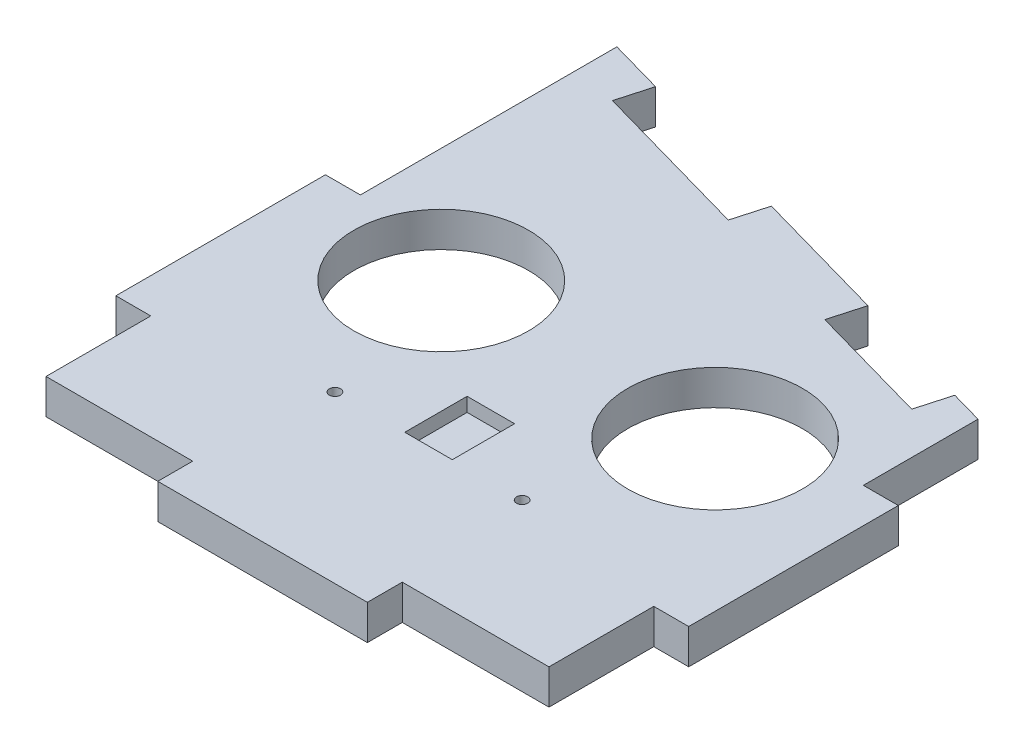
ISO-10303-21;
HEADER;
FILE_DESCRIPTION(('STEP AP214'),'2;1');
FILE_NAME('part.step','',(''),(''),'','','');
FILE_SCHEMA(('AUTOMOTIVE_DESIGN { 1 0 10303 214 1 1 1 1 }'));
ENDSEC;
DATA;
#1=APPLICATION_CONTEXT('core data for automotive mechanical design processes');
#2=APPLICATION_PROTOCOL_DEFINITION('international standard','automotive_design',2000,#1);
#3=PRODUCT_CONTEXT('',#1,'mechanical');
#4=PRODUCT('Part','Part','',(#3));
#5=PRODUCT_RELATED_PRODUCT_CATEGORY('part','',(#4));
#6=PRODUCT_DEFINITION_FORMATION('','',#4);
#7=PRODUCT_DEFINITION_CONTEXT('part definition',#1,'design');
#8=PRODUCT_DEFINITION('design','',#6,#7);
#9=PRODUCT_DEFINITION_SHAPE('','',#8);
#10=(LENGTH_UNIT() NAMED_UNIT(*) SI_UNIT(.MILLI.,.METRE.));
#11=(NAMED_UNIT(*) PLANE_ANGLE_UNIT() SI_UNIT($,.RADIAN.));
#12=(NAMED_UNIT(*) SI_UNIT($,.STERADIAN.) SOLID_ANGLE_UNIT());
#13=UNCERTAINTY_MEASURE_WITH_UNIT(LENGTH_MEASURE(1.E-05),#10,'distance_accuracy_value','');
#14=(GEOMETRIC_REPRESENTATION_CONTEXT(3) GLOBAL_UNCERTAINTY_ASSIGNED_CONTEXT((#13)) GLOBAL_UNIT_ASSIGNED_CONTEXT((#10,
#11,#12)) REPRESENTATION_CONTEXT('',''));
#15=CARTESIAN_POINT('',(0.,0.,0.));
#16=DIRECTION('',(0.,0.,1.));
#17=DIRECTION('',(1.,0.,0.));
#18=AXIS2_PLACEMENT_3D('',#15,#16,#17);
#19=CARTESIAN_POINT('',(0.,3.175,0.));
#20=DIRECTION('',(0.,1.,0.));
#21=DIRECTION('',(0.,0.,1.));
#22=AXIS2_PLACEMENT_3D('',#19,#20,#21);
#23=PLANE('',#22);
#24=CARTESIAN_POINT('',(34.544,3.175,-11.9107261914071));
#25=DIRECTION('',(0.,1.,0.));
#26=DIRECTION('',(0.,0.,1.));
#27=AXIS2_PLACEMENT_3D('',#24,#25,#26);
#28=CIRCLE('',#27,0.508000000000002);
#29=CARTESIAN_POINT('',(34.544,3.175,-11.4027261914071));
#30=VERTEX_POINT('',#29);
#31=EDGE_CURVE('E468',#30,#30,#28,.T.);
#32=ORIENTED_EDGE('',*,*,#31,.F.);
#33=EDGE_LOOP('',(#32));
#34=FACE_BOUND('',#33,.T.);
#35=CARTESIAN_POINT('',(17.526,3.175,-11.9107261914071));
#36=DIRECTION('',(0.,1.,0.));
#37=DIRECTION('',(0.,0.,1.));
#38=AXIS2_PLACEMENT_3D('',#35,#36,#37);
#39=CIRCLE('',#38,0.508000000000002);
#40=CARTESIAN_POINT('',(17.526,3.175,-11.4027261914071));
#41=VERTEX_POINT('',#40);
#42=EDGE_CURVE('E462',#41,#41,#39,.T.);
#43=ORIENTED_EDGE('',*,*,#42,.F.);
#44=EDGE_LOOP('',(#43));
#45=FACE_BOUND('',#44,.T.);
#46=DIRECTION('',(0.,0.,1.));
#47=VECTOR('',#46,1.);
#48=CARTESIAN_POINT('',(23.876,3.175,-17.5749261914071));
#49=LINE('',#48,#47);
#50=CARTESIAN_POINT('',(23.876,3.175,-17.5749261914071));
#51=VERTEX_POINT('',#50);
#52=CARTESIAN_POINT('',(23.876,3.175,-11.9107261914071));
#53=VERTEX_POINT('',#52);
#54=EDGE_CURVE('E48',#51,#53,#49,.T.);
#55=ORIENTED_EDGE('',*,*,#54,.F.);
#56=DIRECTION('',(-1.,0.,0.));
#57=VECTOR('',#56,1.);
#58=CARTESIAN_POINT('',(23.876,3.175,-17.5749261914071));
#59=LINE('',#58,#57);
#60=CARTESIAN_POINT('',(28.194,3.175,-17.5749261914071));
#61=VERTEX_POINT('',#60);
#62=EDGE_CURVE('E440',#61,#51,#59,.T.);
#63=ORIENTED_EDGE('',*,*,#62,.F.);
#64=DIRECTION('',(0.,0.,-1.));
#65=VECTOR('',#64,1.);
#66=CARTESIAN_POINT('',(28.194,3.175,-17.5749261914071));
#67=LINE('',#66,#65);
#68=CARTESIAN_POINT('',(28.194,3.175,-11.9107261914071));
#69=VERTEX_POINT('',#68);
#70=EDGE_CURVE('E444',#69,#61,#67,.T.);
#71=ORIENTED_EDGE('',*,*,#70,.F.);
#72=DIRECTION('',(1.,0.,0.));
#73=VECTOR('',#72,1.);
#74=CARTESIAN_POINT('',(23.876,3.175,-11.9107261914071));
#75=LINE('',#74,#73);
#76=EDGE_CURVE('E447',#53,#69,#75,.T.);
#77=ORIENTED_EDGE('',*,*,#76,.F.);
#78=EDGE_LOOP('',(#55,#63,#71,#77));
#79=FACE_BOUND('',#78,.T.);
#80=CARTESIAN_POINT('',(13.589,3.175,-25.5124261914071));
#81=DIRECTION('',(0.,1.,0.));
#82=DIRECTION('',(0.,0.,1.));
#83=AXIS2_PLACEMENT_3D('',#80,#81,#82);
#84=CIRCLE('',#83,7.93750000000001);
#85=CARTESIAN_POINT('',(13.589,3.175,-17.5749261914071));
#86=VERTEX_POINT('',#85);
#87=EDGE_CURVE('E242',#86,#86,#84,.T.);
#88=ORIENTED_EDGE('',*,*,#87,.F.);
#89=EDGE_LOOP('',(#88));
#90=FACE_BOUND('',#89,.T.);
#91=DIRECTION('',(0.,0.,1.));
#92=VECTOR('',#91,1.);
#93=CARTESIAN_POINT('',(16.51,3.175,0.));
#94=LINE('',#93,#92);
#95=CARTESIAN_POINT('',(16.51,3.175,0.));
#96=VERTEX_POINT('',#95);
#97=CARTESIAN_POINT('',(16.51,3.175,3.175));
#98=VERTEX_POINT('',#97);
#99=EDGE_CURVE('E286',#96,#98,#94,.T.);
#100=ORIENTED_EDGE('',*,*,#99,.T.);
#101=DIRECTION('',(1.,0.,0.));
#102=VECTOR('',#101,1.);
#103=CARTESIAN_POINT('',(16.51,3.175,3.175));
#104=LINE('',#103,#102);
#105=CARTESIAN_POINT('',(35.56,3.175,3.175));
#106=VERTEX_POINT('',#105);
#107=EDGE_CURVE('E146',#98,#106,#104,.T.);
#108=ORIENTED_EDGE('',*,*,#107,.T.);
#109=DIRECTION('',(0.,0.,-1.));
#110=VECTOR('',#109,1.);
#111=CARTESIAN_POINT('',(35.56,3.175,3.175));
#112=LINE('',#111,#110);
#113=CARTESIAN_POINT('',(35.56,3.175,0.));
#114=VERTEX_POINT('',#113);
#115=EDGE_CURVE('E349',#106,#114,#112,.T.);
#116=ORIENTED_EDGE('',*,*,#115,.T.);
#117=DIRECTION('',(1.,0.,0.));
#118=VECTOR('',#117,1.);
#119=CARTESIAN_POINT('',(35.56,3.175,0.));
#120=LINE('',#119,#118);
#121=CARTESIAN_POINT('',(48.895,3.175,0.));
#122=VERTEX_POINT('',#121);
#123=EDGE_CURVE('E368',#114,#122,#120,.T.);
#124=ORIENTED_EDGE('',*,*,#123,.T.);
#125=DIRECTION('',(0.,0.,-1.));
#126=VECTOR('',#125,1.);
#127=CARTESIAN_POINT('',(48.895,3.175,0.));
#128=LINE('',#127,#126);
#129=CARTESIAN_POINT('',(48.895,3.175,-9.525));
#130=VERTEX_POINT('',#129);
#131=EDGE_CURVE('E365',#122,#130,#128,.T.);
#132=ORIENTED_EDGE('',*,*,#131,.T.);
#133=DIRECTION('',(1.,0.,0.));
#134=VECTOR('',#133,1.);
#135=CARTESIAN_POINT('',(52.07,3.175,-9.525));
#136=LINE('',#135,#134);
#137=CARTESIAN_POINT('',(52.07,3.175,-9.525));
#138=VERTEX_POINT('',#137);
#139=EDGE_CURVE('E367',#130,#138,#136,.T.);
#140=ORIENTED_EDGE('',*,*,#139,.T.);
#141=DIRECTION('',(0.,0.,-1.));
#142=VECTOR('',#141,1.);
#143=CARTESIAN_POINT('',(52.07,3.175,-28.575));
#144=LINE('',#143,#142);
#145=CARTESIAN_POINT('',(52.07,3.175,-28.575));
#146=VERTEX_POINT('',#145);
#147=EDGE_CURVE('E370',#138,#146,#144,.T.);
#148=ORIENTED_EDGE('',*,*,#147,.T.);
#149=DIRECTION('',(-1.,0.,0.));
#150=VECTOR('',#149,1.);
#151=CARTESIAN_POINT('',(48.895,3.175,-28.575));
#152=LINE('',#151,#150);
#153=CARTESIAN_POINT('',(48.895,3.175,-28.575));
#154=VERTEX_POINT('',#153);
#155=EDGE_CURVE('E376',#146,#154,#152,.T.);
#156=ORIENTED_EDGE('',*,*,#155,.T.);
#157=DIRECTION('',(0.,0.,-1.));
#158=VECTOR('',#157,1.);
#159=CARTESIAN_POINT('',(48.895,3.175,-28.575));
#160=LINE('',#159,#158);
#161=CARTESIAN_POINT('',(48.895,3.175,-38.9956183909462));
#162=VERTEX_POINT('',#161);
#163=EDGE_CURVE('E378',#154,#162,#160,.T.);
#164=ORIENTED_EDGE('',*,*,#163,.T.);
#165=DIRECTION('',(-0.962441314553988,0.,-0.271489808353079));
#166=VECTOR('',#165,1.);
#167=CARTESIAN_POINT('',(45.9584976525822,3.175,-39.823960283042));
#168=LINE('',#167,#166);
#169=CARTESIAN_POINT('',(45.9584976525822,3.175,-39.823960283042));
#170=VERTEX_POINT('',#169);
#171=EDGE_CURVE('E380',#162,#170,#168,.T.);
#172=ORIENTED_EDGE('',*,*,#171,.T.);
#173=DIRECTION('',(-0.271489808353065,0.,0.962441314553992));
#174=VECTOR('',#173,1.);
#175=CARTESIAN_POINT('',(45.9584976525822,3.175,-39.823960283042));
#176=LINE('',#175,#174);
#177=CARTESIAN_POINT('',(45.0965175110612,3.175,-36.7682091093331));
#178=VERTEX_POINT('',#177);
#179=EDGE_CURVE('E382',#170,#178,#176,.T.);
#180=ORIENTED_EDGE('',*,*,#179,.T.);
#181=DIRECTION('',(-0.962441314553991,0.,-0.271489808353068));
#182=VECTOR('',#181,1.);
#183=CARTESIAN_POINT('',(45.0965175110612,3.175,-36.7682091093331));
#184=LINE('',#183,#182);
#185=CARTESIAN_POINT('',(34.0958132857091,3.175,-39.8713376188087));
#186=VERTEX_POINT('',#185);
#187=EDGE_CURVE('E384',#178,#186,#184,.T.);
#188=ORIENTED_EDGE('',*,*,#187,.T.);
#189=DIRECTION('',(0.271489808353069,0.,-0.962441314553991));
#190=VECTOR('',#189,1.);
#191=CARTESIAN_POINT('',(34.0958132857091,3.175,-39.8713376188087));
#192=LINE('',#191,#190);
#193=CARTESIAN_POINT('',(34.9577934272301,3.175,-42.9270887925176));
#194=VERTEX_POINT('',#193);
#195=EDGE_CURVE('E386',#186,#194,#192,.T.);
#196=ORIENTED_EDGE('',*,*,#195,.T.);
#197=DIRECTION('',(-0.962441314553991,0.,-0.271489808353068));
#198=VECTOR('',#197,1.);
#199=CARTESIAN_POINT('',(34.9577934272301,3.175,-42.9270887925176));
#200=LINE('',#199,#198);
#201=CARTESIAN_POINT('',(22.7347887323944,3.175,-46.3750093586016));
#202=VERTEX_POINT('',#201);
#203=EDGE_CURVE('E388',#194,#202,#200,.T.);
#204=ORIENTED_EDGE('',*,*,#203,.T.);
#205=DIRECTION('',(-0.271489808353069,0.,0.962441314553991));
#206=VECTOR('',#205,1.);
#207=CARTESIAN_POINT('',(22.7347887323944,3.175,-46.3750093586016));
#208=LINE('',#207,#206);
#209=CARTESIAN_POINT('',(21.8728085908734,3.175,-43.3192581848926));
#210=VERTEX_POINT('',#209);
#211=EDGE_CURVE('E390',#202,#210,#208,.T.);
#212=ORIENTED_EDGE('',*,*,#211,.T.);
#213=DIRECTION('',(-0.962441314553991,0.,-0.271489808353068));
#214=VECTOR('',#213,1.);
#215=CARTESIAN_POINT('',(21.8728085908734,3.175,-43.3192581848926));
#216=LINE('',#215,#214);
#217=CARTESIAN_POINT('',(7.20520295707056,3.175,-47.4567628641934));
#218=VERTEX_POINT('',#217);
#219=EDGE_CURVE('E392',#210,#218,#216,.T.);
#220=ORIENTED_EDGE('',*,*,#219,.T.);
#221=DIRECTION('',(0.271489808353068,0.,-0.962441314553991));
#222=VECTOR('',#221,1.);
#223=CARTESIAN_POINT('',(7.20520295707056,3.175,-47.4567628641934));
#224=LINE('',#223,#222);
#225=CARTESIAN_POINT('',(8.06718309859155,3.175,-50.5125140379023));
#226=VERTEX_POINT('',#225);
#227=EDGE_CURVE('E394',#218,#226,#224,.T.);
#228=ORIENTED_EDGE('',*,*,#227,.T.);
#229=DIRECTION('',(-0.962441314553991,0.,-0.271489808353068));
#230=VECTOR('',#229,1.);
#231=CARTESIAN_POINT('',(8.06718309859155,3.175,-50.5125140379023));
#232=LINE('',#231,#230);
#233=CARTESIAN_POINT('',(3.175,3.175,-51.8925232205715));
#234=VERTEX_POINT('',#233);
#235=EDGE_CURVE('E396',#226,#234,#232,.T.);
#236=ORIENTED_EDGE('',*,*,#235,.T.);
#237=DIRECTION('',(0.,0.,1.));
#238=VECTOR('',#237,1.);
#239=CARTESIAN_POINT('',(3.175,3.175,-28.575));
#240=LINE('',#239,#238);
#241=CARTESIAN_POINT('',(3.175,3.175,-28.575));
#242=VERTEX_POINT('',#241);
#243=EDGE_CURVE('E398',#234,#242,#240,.T.);
#244=ORIENTED_EDGE('',*,*,#243,.T.);
#245=DIRECTION('',(-1.,0.,0.));
#246=VECTOR('',#245,1.);
#247=CARTESIAN_POINT('',(0.,3.175,-28.575));
#248=LINE('',#247,#246);
#249=CARTESIAN_POINT('',(0.,3.175,-28.575));
#250=VERTEX_POINT('',#249);
#251=EDGE_CURVE('E400',#242,#250,#248,.T.);
#252=ORIENTED_EDGE('',*,*,#251,.T.);
#253=DIRECTION('',(0.,0.,1.));
#254=VECTOR('',#253,1.);
#255=CARTESIAN_POINT('',(0.,3.175,-28.575));
#256=LINE('',#255,#254);
#257=CARTESIAN_POINT('',(0.,3.175,-9.525));
#258=VERTEX_POINT('',#257);
#259=EDGE_CURVE('E217',#250,#258,#256,.T.);
#260=ORIENTED_EDGE('',*,*,#259,.T.);
#261=DIRECTION('',(1.,0.,0.));
#262=VECTOR('',#261,1.);
#263=CARTESIAN_POINT('',(3.175,3.175,-9.525));
#264=LINE('',#263,#262);
#265=CARTESIAN_POINT('',(3.175,3.175,-9.525));
#266=VERTEX_POINT('',#265);
#267=EDGE_CURVE('E210',#258,#266,#264,.T.);
#268=ORIENTED_EDGE('',*,*,#267,.T.);
#269=DIRECTION('',(0.,0.,1.));
#270=VECTOR('',#269,1.);
#271=CARTESIAN_POINT('',(3.175,3.175,-9.525));
#272=LINE('',#271,#270);
#273=CARTESIAN_POINT('',(3.175,3.175,0.));
#274=VERTEX_POINT('',#273);
#275=EDGE_CURVE('E214',#266,#274,#272,.T.);
#276=ORIENTED_EDGE('',*,*,#275,.T.);
#277=DIRECTION('',(1.,0.,0.));
#278=VECTOR('',#277,1.);
#279=CARTESIAN_POINT('',(16.51,3.175,0.));
#280=LINE('',#279,#278);
#281=EDGE_CURVE('E57',#274,#96,#280,.T.);
#282=ORIENTED_EDGE('',*,*,#281,.T.);
#283=EDGE_LOOP('',(#100,#108,#116,#124,#132,#140,#148,#156,#164,#172,#180,#188,#196,#204,#212,
#220,#228,#236,#244,#252,#260,#268,#276,#282));
#284=FACE_BOUND('',#283,.T.);
#285=CARTESIAN_POINT('',(38.481,3.175,-25.5124261914071));
#286=DIRECTION('',(0.,1.,0.));
#287=DIRECTION('',(0.,0.,1.));
#288=AXIS2_PLACEMENT_3D('',#285,#286,#287);
#289=CIRCLE('',#288,7.9375);
#290=CARTESIAN_POINT('',(38.481,3.175,-17.5749261914071));
#291=VERTEX_POINT('',#290);
#292=EDGE_CURVE('E421',#291,#291,#289,.T.);
#293=ORIENTED_EDGE('',*,*,#292,.F.);
#294=EDGE_LOOP('',(#293));
#295=FACE_BOUND('',#294,.T.);
#296=ADVANCED_FACE('F33',(#34,#45,#79,#90,#284,#295),#23,.T.);
#297=CARTESIAN_POINT('',(0.,0.,0.));
#298=DIRECTION('',(0.,1.,0.));
#299=DIRECTION('',(0.,0.,1.));
#300=AXIS2_PLACEMENT_3D('',#297,#298,#299);
#301=PLANE('',#300);
#302=CARTESIAN_POINT('',(34.544,0.,-11.9107261914071));
#303=DIRECTION('',(0.,1.,0.));
#304=DIRECTION('',(0.,0.,1.));
#305=AXIS2_PLACEMENT_3D('',#302,#303,#304);
#306=CIRCLE('',#305,0.508000000000002);
#307=CARTESIAN_POINT('',(34.544,0.,-11.4027261914071));
#308=VERTEX_POINT('',#307);
#309=EDGE_CURVE('E465',#308,#308,#306,.T.);
#310=ORIENTED_EDGE('',*,*,#309,.T.);
#311=EDGE_LOOP('',(#310));
#312=FACE_BOUND('',#311,.T.);
#313=CARTESIAN_POINT('',(17.526,0.,-11.9107261914071));
#314=DIRECTION('',(0.,1.,0.));
#315=DIRECTION('',(0.,0.,1.));
#316=AXIS2_PLACEMENT_3D('',#313,#314,#315);
#317=CIRCLE('',#316,0.508000000000002);
#318=CARTESIAN_POINT('',(17.526,0.,-11.4027261914071));
#319=VERTEX_POINT('',#318);
#320=EDGE_CURVE('E451',#319,#319,#317,.T.);
#321=ORIENTED_EDGE('',*,*,#320,.T.);
#322=EDGE_LOOP('',(#321));
#323=FACE_BOUND('',#322,.T.);
#324=DIRECTION('',(0.,0.,1.));
#325=VECTOR('',#324,1.);
#326=CARTESIAN_POINT('',(16.51,0.,0.));
#327=LINE('',#326,#325);
#328=CARTESIAN_POINT('',(16.51,0.,0.));
#329=VERTEX_POINT('',#328);
#330=CARTESIAN_POINT('',(16.51,0.,3.175));
#331=VERTEX_POINT('',#330);
#332=EDGE_CURVE('E238',#329,#331,#327,.T.);
#333=ORIENTED_EDGE('',*,*,#332,.F.);
#334=DIRECTION('',(1.,0.,0.));
#335=VECTOR('',#334,1.);
#336=CARTESIAN_POINT('',(16.51,0.,0.));
#337=LINE('',#336,#335);
#338=CARTESIAN_POINT('',(3.175,0.,0.));
#339=VERTEX_POINT('',#338);
#340=EDGE_CURVE('E138',#339,#329,#337,.T.);
#341=ORIENTED_EDGE('',*,*,#340,.F.);
#342=DIRECTION('',(0.,0.,1.));
#343=VECTOR('',#342,1.);
#344=CARTESIAN_POINT('',(3.175,0.,-9.525));
#345=LINE('',#344,#343);
#346=CARTESIAN_POINT('',(3.175,0.,-9.525));
#347=VERTEX_POINT('',#346);
#348=EDGE_CURVE('E283',#347,#339,#345,.T.);
#349=ORIENTED_EDGE('',*,*,#348,.F.);
#350=DIRECTION('',(1.,0.,0.));
#351=VECTOR('',#350,1.);
#352=CARTESIAN_POINT('',(3.175,0.,-9.525));
#353=LINE('',#352,#351);
#354=CARTESIAN_POINT('',(0.,0.,-9.525));
#355=VERTEX_POINT('',#354);
#356=EDGE_CURVE('E226',#355,#347,#353,.T.);
#357=ORIENTED_EDGE('',*,*,#356,.F.);
#358=DIRECTION('',(0.,0.,1.));
#359=VECTOR('',#358,1.);
#360=CARTESIAN_POINT('',(0.,0.,-28.575));
#361=LINE('',#360,#359);
#362=CARTESIAN_POINT('',(0.,0.,-28.575));
#363=VERTEX_POINT('',#362);
#364=EDGE_CURVE('E280',#363,#355,#361,.T.);
#365=ORIENTED_EDGE('',*,*,#364,.F.);
#366=DIRECTION('',(-1.,0.,0.));
#367=VECTOR('',#366,1.);
#368=CARTESIAN_POINT('',(0.,0.,-28.575));
#369=LINE('',#368,#367);
#370=CARTESIAN_POINT('',(3.175,0.,-28.575));
#371=VERTEX_POINT('',#370);
#372=EDGE_CURVE('E278',#371,#363,#369,.T.);
#373=ORIENTED_EDGE('',*,*,#372,.F.);
#374=DIRECTION('',(0.,0.,1.));
#375=VECTOR('',#374,1.);
#376=CARTESIAN_POINT('',(3.175,0.,-28.575));
#377=LINE('',#376,#375);
#378=CARTESIAN_POINT('',(3.175,0.,-51.8925232205715));
#379=VERTEX_POINT('',#378);
#380=EDGE_CURVE('E276',#379,#371,#377,.T.);
#381=ORIENTED_EDGE('',*,*,#380,.F.);
#382=DIRECTION('',(-0.962441314553991,0.,-0.271489808353068));
#383=VECTOR('',#382,1.);
#384=CARTESIAN_POINT('',(8.06718309859155,0.,-50.5125140379023));
#385=LINE('',#384,#383);
#386=CARTESIAN_POINT('',(8.06718309859155,0.,-50.5125140379023));
#387=VERTEX_POINT('',#386);
#388=EDGE_CURVE('E274',#387,#379,#385,.T.);
#389=ORIENTED_EDGE('',*,*,#388,.F.);
#390=DIRECTION('',(0.271489808353068,0.,-0.962441314553991));
#391=VECTOR('',#390,1.);
#392=CARTESIAN_POINT('',(7.20520295707056,0.,-47.4567628641934));
#393=LINE('',#392,#391);
#394=CARTESIAN_POINT('',(7.20520295707056,0.,-47.4567628641934));
#395=VERTEX_POINT('',#394);
#396=EDGE_CURVE('E272',#395,#387,#393,.T.);
#397=ORIENTED_EDGE('',*,*,#396,.F.);
#398=DIRECTION('',(-0.962441314553991,0.,-0.271489808353068));
#399=VECTOR('',#398,1.);
#400=CARTESIAN_POINT('',(21.8728085908734,0.,-43.3192581848926));
#401=LINE('',#400,#399);
#402=CARTESIAN_POINT('',(21.8728085908734,0.,-43.3192581848926));
#403=VERTEX_POINT('',#402);
#404=EDGE_CURVE('E270',#403,#395,#401,.T.);
#405=ORIENTED_EDGE('',*,*,#404,.F.);
#406=DIRECTION('',(-0.271489808353069,0.,0.962441314553991));
#407=VECTOR('',#406,1.);
#408=CARTESIAN_POINT('',(22.7347887323944,0.,-46.3750093586016));
#409=LINE('',#408,#407);
#410=CARTESIAN_POINT('',(22.7347887323944,0.,-46.3750093586016));
#411=VERTEX_POINT('',#410);
#412=EDGE_CURVE('E268',#411,#403,#409,.T.);
#413=ORIENTED_EDGE('',*,*,#412,.F.);
#414=DIRECTION('',(-0.962441314553991,0.,-0.271489808353068));
#415=VECTOR('',#414,1.);
#416=CARTESIAN_POINT('',(34.9577934272301,0.,-42.9270887925176));
#417=LINE('',#416,#415);
#418=CARTESIAN_POINT('',(34.9577934272301,0.,-42.9270887925176));
#419=VERTEX_POINT('',#418);
#420=EDGE_CURVE('E266',#419,#411,#417,.T.);
#421=ORIENTED_EDGE('',*,*,#420,.F.);
#422=DIRECTION('',(0.271489808353069,0.,-0.962441314553991));
#423=VECTOR('',#422,1.);
#424=CARTESIAN_POINT('',(34.0958132857091,0.,-39.8713376188087));
#425=LINE('',#424,#423);
#426=CARTESIAN_POINT('',(34.0958132857091,0.,-39.8713376188087));
#427=VERTEX_POINT('',#426);
#428=EDGE_CURVE('E264',#427,#419,#425,.T.);
#429=ORIENTED_EDGE('',*,*,#428,.F.);
#430=DIRECTION('',(-0.962441314553991,0.,-0.271489808353068));
#431=VECTOR('',#430,1.);
#432=CARTESIAN_POINT('',(45.0965175110612,0.,-36.7682091093331));
#433=LINE('',#432,#431);
#434=CARTESIAN_POINT('',(45.0965175110612,0.,-36.7682091093331));
#435=VERTEX_POINT('',#434);
#436=EDGE_CURVE('E262',#435,#427,#433,.T.);
#437=ORIENTED_EDGE('',*,*,#436,.F.);
#438=DIRECTION('',(-0.271489808353065,0.,0.962441314553992));
#439=VECTOR('',#438,1.);
#440=CARTESIAN_POINT('',(45.9584976525822,0.,-39.823960283042));
#441=LINE('',#440,#439);
#442=CARTESIAN_POINT('',(45.9584976525822,0.,-39.823960283042));
#443=VERTEX_POINT('',#442);
#444=EDGE_CURVE('E260',#443,#435,#441,.T.);
#445=ORIENTED_EDGE('',*,*,#444,.F.);
#446=DIRECTION('',(-0.962441314553988,0.,-0.271489808353079));
#447=VECTOR('',#446,1.);
#448=CARTESIAN_POINT('',(45.9584976525822,0.,-39.823960283042));
#449=LINE('',#448,#447);
#450=CARTESIAN_POINT('',(48.895,0.,-38.9956183909462));
#451=VERTEX_POINT('',#450);
#452=EDGE_CURVE('E258',#451,#443,#449,.T.);
#453=ORIENTED_EDGE('',*,*,#452,.F.);
#454=DIRECTION('',(0.,0.,-1.));
#455=VECTOR('',#454,1.);
#456=CARTESIAN_POINT('',(48.895,0.,-28.575));
#457=LINE('',#456,#455);
#458=CARTESIAN_POINT('',(48.895,0.,-28.575));
#459=VERTEX_POINT('',#458);
#460=EDGE_CURVE('E256',#459,#451,#457,.T.);
#461=ORIENTED_EDGE('',*,*,#460,.F.);
#462=DIRECTION('',(-1.,0.,0.));
#463=VECTOR('',#462,1.);
#464=CARTESIAN_POINT('',(48.895,0.,-28.575));
#465=LINE('',#464,#463);
#466=CARTESIAN_POINT('',(52.07,0.,-28.575));
#467=VERTEX_POINT('',#466);
#468=EDGE_CURVE('E254',#467,#459,#465,.T.);
#469=ORIENTED_EDGE('',*,*,#468,.F.);
#470=DIRECTION('',(0.,0.,-1.));
#471=VECTOR('',#470,1.);
#472=CARTESIAN_POINT('',(52.07,0.,-28.575));
#473=LINE('',#472,#471);
#474=CARTESIAN_POINT('',(52.07,0.,-9.525));
#475=VERTEX_POINT('',#474);
#476=EDGE_CURVE('E252',#475,#467,#473,.T.);
#477=ORIENTED_EDGE('',*,*,#476,.F.);
#478=DIRECTION('',(1.,0.,0.));
#479=VECTOR('',#478,1.);
#480=CARTESIAN_POINT('',(52.07,0.,-9.525));
#481=LINE('',#480,#479);
#482=CARTESIAN_POINT('',(48.895,0.,-9.525));
#483=VERTEX_POINT('',#482);
#484=EDGE_CURVE('E250',#483,#475,#481,.T.);
#485=ORIENTED_EDGE('',*,*,#484,.F.);
#486=DIRECTION('',(0.,0.,-1.));
#487=VECTOR('',#486,1.);
#488=CARTESIAN_POINT('',(48.895,0.,0.));
#489=LINE('',#488,#487);
#490=CARTESIAN_POINT('',(48.895,0.,0.));
#491=VERTEX_POINT('',#490);
#492=EDGE_CURVE('E248',#491,#483,#489,.T.);
#493=ORIENTED_EDGE('',*,*,#492,.F.);
#494=DIRECTION('',(1.,0.,0.));
#495=VECTOR('',#494,1.);
#496=CARTESIAN_POINT('',(35.56,0.,0.));
#497=LINE('',#496,#495);
#498=CARTESIAN_POINT('',(35.56,0.,0.));
#499=VERTEX_POINT('',#498);
#500=EDGE_CURVE('E246',#499,#491,#497,.T.);
#501=ORIENTED_EDGE('',*,*,#500,.F.);
#502=DIRECTION('',(0.,0.,-1.));
#503=VECTOR('',#502,1.);
#504=CARTESIAN_POINT('',(35.56,0.,3.175));
#505=LINE('',#504,#503);
#506=CARTESIAN_POINT('',(35.56,0.,3.175));
#507=VERTEX_POINT('',#506);
#508=EDGE_CURVE('E244',#507,#499,#505,.T.);
#509=ORIENTED_EDGE('',*,*,#508,.F.);
#510=DIRECTION('',(1.,0.,0.));
#511=VECTOR('',#510,1.);
#512=CARTESIAN_POINT('',(16.51,0.,3.175));
#513=LINE('',#512,#511);
#514=EDGE_CURVE('E241',#331,#507,#513,.T.);
#515=ORIENTED_EDGE('',*,*,#514,.F.);
#516=EDGE_LOOP('',(#333,#341,#349,#357,#365,#373,#381,#389,#397,#405,#413,#421,#429,#437,#445,
#453,#461,#469,#477,#485,#493,#501,#509,#515));
#517=FACE_BOUND('',#516,.T.);
#518=CARTESIAN_POINT('',(13.589,0.,-25.5124261914071));
#519=DIRECTION('',(0.,1.,0.));
#520=DIRECTION('',(0.,0.,1.));
#521=AXIS2_PLACEMENT_3D('',#518,#519,#520);
#522=CIRCLE('',#521,7.93750000000001);
#523=CARTESIAN_POINT('',(13.589,0.,-17.5749261914071));
#524=VERTEX_POINT('',#523);
#525=EDGE_CURVE('E418',#524,#524,#522,.T.);
#526=ORIENTED_EDGE('',*,*,#525,.T.);
#527=EDGE_LOOP('',(#526));
#528=FACE_BOUND('',#527,.T.);
#529=CARTESIAN_POINT('',(38.481,0.,-25.5124261914071));
#530=DIRECTION('',(0.,1.,0.));
#531=DIRECTION('',(0.,0.,1.));
#532=AXIS2_PLACEMENT_3D('',#529,#530,#531);
#533=CIRCLE('',#532,7.9375);
#534=CARTESIAN_POINT('',(38.481,0.,-17.5749261914071));
#535=VERTEX_POINT('',#534);
#536=EDGE_CURVE('E424',#535,#535,#533,.T.);
#537=ORIENTED_EDGE('',*,*,#536,.T.);
#538=EDGE_LOOP('',(#537));
#539=FACE_BOUND('',#538,.T.);
#540=ADVANCED_FACE('F353',(#312,#323,#517,#528,#539),#301,.F.);
#541=CARTESIAN_POINT('',(16.51,3.175,0.));
#542=DIRECTION('',(1.,0.,0.));
#543=DIRECTION('',(0.,0.,-1.));
#544=AXIS2_PLACEMENT_3D('',#541,#542,#543);
#545=PLANE('',#544);
#546=ORIENTED_EDGE('',*,*,#332,.T.);
#547=DIRECTION('',(0.,-1.,0.));
#548=VECTOR('',#547,1.);
#549=CARTESIAN_POINT('',(16.51,3.175,3.175));
#550=LINE('',#549,#548);
#551=EDGE_CURVE('E11',#98,#331,#550,.T.);
#552=ORIENTED_EDGE('',*,*,#551,.F.);
#553=ORIENTED_EDGE('',*,*,#99,.F.);
#554=DIRECTION('',(0.,-1.,0.));
#555=VECTOR('',#554,1.);
#556=CARTESIAN_POINT('',(16.51,3.175,0.));
#557=LINE('',#556,#555);
#558=EDGE_CURVE('E234',#96,#329,#557,.T.);
#559=ORIENTED_EDGE('',*,*,#558,.T.);
#560=EDGE_LOOP('',(#546,#552,#553,#559));
#561=FACE_BOUND('',#560,.T.);
#562=ADVANCED_FACE('F35',(#561),#545,.F.);
#563=CARTESIAN_POINT('',(16.51,3.175,3.175));
#564=DIRECTION('',(0.,0.,-1.));
#565=DIRECTION('',(-1.,0.,0.));
#566=AXIS2_PLACEMENT_3D('',#563,#564,#565);
#567=PLANE('',#566);
#568=ORIENTED_EDGE('',*,*,#514,.T.);
#569=DIRECTION('',(0.,-1.,0.));
#570=VECTOR('',#569,1.);
#571=CARTESIAN_POINT('',(35.56,3.175,3.175));
#572=LINE('',#571,#570);
#573=EDGE_CURVE('E41',#106,#507,#572,.T.);
#574=ORIENTED_EDGE('',*,*,#573,.F.);
#575=ORIENTED_EDGE('',*,*,#107,.F.);
#576=ORIENTED_EDGE('',*,*,#551,.T.);
#577=EDGE_LOOP('',(#568,#574,#575,#576));
#578=FACE_BOUND('',#577,.T.);
#579=ADVANCED_FACE('F586',(#578),#567,.F.);
#580=CARTESIAN_POINT('',(35.56,3.175,3.175));
#581=DIRECTION('',(-1.,0.,0.));
#582=DIRECTION('',(0.,0.,1.));
#583=AXIS2_PLACEMENT_3D('',#580,#581,#582);
#584=PLANE('',#583);
#585=ORIENTED_EDGE('',*,*,#508,.T.);
#586=DIRECTION('',(0.,-1.,0.));
#587=VECTOR('',#586,1.);
#588=CARTESIAN_POINT('',(35.56,3.175,0.));
#589=LINE('',#588,#587);
#590=EDGE_CURVE('E341',#114,#499,#589,.T.);
#591=ORIENTED_EDGE('',*,*,#590,.F.);
#592=ORIENTED_EDGE('',*,*,#115,.F.);
#593=ORIENTED_EDGE('',*,*,#573,.T.);
#594=EDGE_LOOP('',(#585,#591,#592,#593));
#595=FACE_BOUND('',#594,.T.);
#596=ADVANCED_FACE('F347',(#595),#584,.F.);
#597=CARTESIAN_POINT('',(35.56,3.175,0.));
#598=DIRECTION('',(0.,0.,-1.));
#599=DIRECTION('',(-1.,0.,0.));
#600=AXIS2_PLACEMENT_3D('',#597,#598,#599);
#601=PLANE('',#600);
#602=ORIENTED_EDGE('',*,*,#500,.T.);
#603=DIRECTION('',(0.,-1.,0.));
#604=VECTOR('',#603,1.);
#605=CARTESIAN_POINT('',(48.895,3.175,0.));
#606=LINE('',#605,#604);
#607=EDGE_CURVE('E338',#122,#491,#606,.T.);
#608=ORIENTED_EDGE('',*,*,#607,.F.);
#609=ORIENTED_EDGE('',*,*,#123,.F.);
#610=ORIENTED_EDGE('',*,*,#590,.T.);
#611=EDGE_LOOP('',(#602,#608,#609,#610));
#612=FACE_BOUND('',#611,.T.);
#613=ADVANCED_FACE('F359',(#612),#601,.F.);
#614=CARTESIAN_POINT('',(48.895,3.175,0.));
#615=DIRECTION('',(-1.,0.,0.));
#616=DIRECTION('',(0.,0.,1.));
#617=AXIS2_PLACEMENT_3D('',#614,#615,#616);
#618=PLANE('',#617);
#619=ORIENTED_EDGE('',*,*,#492,.T.);
#620=DIRECTION('',(0.,-1.,0.));
#621=VECTOR('',#620,1.);
#622=CARTESIAN_POINT('',(48.895,3.175,-9.525));
#623=LINE('',#622,#621);
#624=EDGE_CURVE('E335',#130,#483,#623,.T.);
#625=ORIENTED_EDGE('',*,*,#624,.F.);
#626=ORIENTED_EDGE('',*,*,#131,.F.);
#627=ORIENTED_EDGE('',*,*,#607,.T.);
#628=EDGE_LOOP('',(#619,#625,#626,#627));
#629=FACE_BOUND('',#628,.T.);
#630=ADVANCED_FACE('F363',(#629),#618,.F.);
#631=CARTESIAN_POINT('',(52.07,3.175,-9.525));
#632=DIRECTION('',(0.,0.,-1.));
#633=DIRECTION('',(-1.,0.,0.));
#634=AXIS2_PLACEMENT_3D('',#631,#632,#633);
#635=PLANE('',#634);
#636=ORIENTED_EDGE('',*,*,#484,.T.);
#637=DIRECTION('',(0.,-1.,0.));
#638=VECTOR('',#637,1.);
#639=CARTESIAN_POINT('',(52.07,3.175,-9.525));
#640=LINE('',#639,#638);
#641=EDGE_CURVE('E332',#138,#475,#640,.T.);
#642=ORIENTED_EDGE('',*,*,#641,.F.);
#643=ORIENTED_EDGE('',*,*,#139,.F.);
#644=ORIENTED_EDGE('',*,*,#624,.T.);
#645=EDGE_LOOP('',(#636,#642,#643,#644));
#646=FACE_BOUND('',#645,.T.);
#647=ADVANCED_FACE('F576',(#646),#635,.F.);
#648=CARTESIAN_POINT('',(52.07,3.175,-28.575));
#649=DIRECTION('',(-1.,0.,0.));
#650=DIRECTION('',(0.,0.,1.));
#651=AXIS2_PLACEMENT_3D('',#648,#649,#650);
#652=PLANE('',#651);
#653=ORIENTED_EDGE('',*,*,#476,.T.);
#654=DIRECTION('',(0.,-1.,0.));
#655=VECTOR('',#654,1.);
#656=CARTESIAN_POINT('',(52.07,3.175,-28.575));
#657=LINE('',#656,#655);
#658=EDGE_CURVE('E329',#146,#467,#657,.T.);
#659=ORIENTED_EDGE('',*,*,#658,.F.);
#660=ORIENTED_EDGE('',*,*,#147,.F.);
#661=ORIENTED_EDGE('',*,*,#641,.T.);
#662=EDGE_LOOP('',(#653,#659,#660,#661));
#663=FACE_BOUND('',#662,.T.);
#664=ADVANCED_FACE('F572',(#663),#652,.F.);
#665=CARTESIAN_POINT('',(48.895,3.175,-28.575));
#666=DIRECTION('',(0.,0.,1.));
#667=DIRECTION('',(1.,0.,0.));
#668=AXIS2_PLACEMENT_3D('',#665,#666,#667);
#669=PLANE('',#668);
#670=ORIENTED_EDGE('',*,*,#468,.T.);
#671=DIRECTION('',(0.,-1.,0.));
#672=VECTOR('',#671,1.);
#673=CARTESIAN_POINT('',(48.895,3.175,-28.575));
#674=LINE('',#673,#672);
#675=EDGE_CURVE('E326',#154,#459,#674,.T.);
#676=ORIENTED_EDGE('',*,*,#675,.F.);
#677=ORIENTED_EDGE('',*,*,#155,.F.);
#678=ORIENTED_EDGE('',*,*,#658,.T.);
#679=EDGE_LOOP('',(#670,#676,#677,#678));
#680=FACE_BOUND('',#679,.T.);
#681=ADVANCED_FACE('F568',(#680),#669,.F.);
#682=CARTESIAN_POINT('',(48.895,3.175,-28.575));
#683=DIRECTION('',(-1.,0.,0.));
#684=DIRECTION('',(0.,0.,1.));
#685=AXIS2_PLACEMENT_3D('',#682,#683,#684);
#686=PLANE('',#685);
#687=ORIENTED_EDGE('',*,*,#460,.T.);
#688=DIRECTION('',(0.,-1.,0.));
#689=VECTOR('',#688,1.);
#690=CARTESIAN_POINT('',(48.895,3.175,-38.9956183909462));
#691=LINE('',#690,#689);
#692=EDGE_CURVE('E323',#162,#451,#691,.T.);
#693=ORIENTED_EDGE('',*,*,#692,.F.);
#694=ORIENTED_EDGE('',*,*,#163,.F.);
#695=ORIENTED_EDGE('',*,*,#675,.T.);
#696=EDGE_LOOP('',(#687,#693,#694,#695));
#697=FACE_BOUND('',#696,.T.);
#698=ADVANCED_FACE('F564',(#697),#686,.F.);
#699=CARTESIAN_POINT('',(45.9584976525822,3.175,-39.823960283042));
#700=DIRECTION('',(-0.271489808353078,0.,0.962441314553988));
#701=DIRECTION('',(0.962441314553988,0.,0.271489808353079));
#702=AXIS2_PLACEMENT_3D('',#699,#700,#701);
#703=PLANE('',#702);
#704=ORIENTED_EDGE('',*,*,#452,.T.);
#705=DIRECTION('',(0.,-1.,0.));
#706=VECTOR('',#705,1.);
#707=CARTESIAN_POINT('',(45.9584976525822,3.175,-39.823960283042));
#708=LINE('',#707,#706);
#709=EDGE_CURVE('E320',#170,#443,#708,.T.);
#710=ORIENTED_EDGE('',*,*,#709,.F.);
#711=ORIENTED_EDGE('',*,*,#171,.F.);
#712=ORIENTED_EDGE('',*,*,#692,.T.);
#713=EDGE_LOOP('',(#704,#710,#711,#712));
#714=FACE_BOUND('',#713,.T.);
#715=ADVANCED_FACE('F560',(#714),#703,.F.);
#716=CARTESIAN_POINT('',(45.9584976525822,3.175,-39.823960283042));
#717=DIRECTION('',(0.962441314553992,0.,0.271489808353065));
#718=DIRECTION('',(0.271489808353065,0.,-0.962441314553992));
#719=AXIS2_PLACEMENT_3D('',#716,#717,#718);
#720=PLANE('',#719);
#721=ORIENTED_EDGE('',*,*,#444,.T.);
#722=DIRECTION('',(0.,-1.,0.));
#723=VECTOR('',#722,1.);
#724=CARTESIAN_POINT('',(45.0965175110612,3.175,-36.7682091093331));
#725=LINE('',#724,#723);
#726=EDGE_CURVE('E317',#178,#435,#725,.T.);
#727=ORIENTED_EDGE('',*,*,#726,.F.);
#728=ORIENTED_EDGE('',*,*,#179,.F.);
#729=ORIENTED_EDGE('',*,*,#709,.T.);
#730=EDGE_LOOP('',(#721,#727,#728,#729));
#731=FACE_BOUND('',#730,.T.);
#732=ADVANCED_FACE('F556',(#731),#720,.F.);
#733=CARTESIAN_POINT('',(45.0965175110612,3.175,-36.7682091093331));
#734=DIRECTION('',(-0.271489808353068,0.,0.962441314553991));
#735=DIRECTION('',(0.962441314553991,0.,0.271489808353068));
#736=AXIS2_PLACEMENT_3D('',#733,#734,#735);
#737=PLANE('',#736);
#738=ORIENTED_EDGE('',*,*,#436,.T.);
#739=DIRECTION('',(0.,-1.,0.));
#740=VECTOR('',#739,1.);
#741=CARTESIAN_POINT('',(34.0958132857091,3.175,-39.8713376188087));
#742=LINE('',#741,#740);
#743=EDGE_CURVE('E314',#186,#427,#742,.T.);
#744=ORIENTED_EDGE('',*,*,#743,.F.);
#745=ORIENTED_EDGE('',*,*,#187,.F.);
#746=ORIENTED_EDGE('',*,*,#726,.T.);
#747=EDGE_LOOP('',(#738,#744,#745,#746));
#748=FACE_BOUND('',#747,.T.);
#749=ADVANCED_FACE('F552',(#748),#737,.F.);
#750=CARTESIAN_POINT('',(34.0958132857091,3.175,-39.8713376188087));
#751=DIRECTION('',(-0.962441314553991,0.,-0.271489808353069));
#752=DIRECTION('',(-0.271489808353069,0.,0.962441314553991));
#753=AXIS2_PLACEMENT_3D('',#750,#751,#752);
#754=PLANE('',#753);
#755=ORIENTED_EDGE('',*,*,#428,.T.);
#756=DIRECTION('',(0.,-1.,0.));
#757=VECTOR('',#756,1.);
#758=CARTESIAN_POINT('',(34.9577934272301,3.175,-42.9270887925176));
#759=LINE('',#758,#757);
#760=EDGE_CURVE('E311',#194,#419,#759,.T.);
#761=ORIENTED_EDGE('',*,*,#760,.F.);
#762=ORIENTED_EDGE('',*,*,#195,.F.);
#763=ORIENTED_EDGE('',*,*,#743,.T.);
#764=EDGE_LOOP('',(#755,#761,#762,#763));
#765=FACE_BOUND('',#764,.T.);
#766=ADVANCED_FACE('F548',(#765),#754,.F.);
#767=CARTESIAN_POINT('',(34.9577934272301,3.175,-42.9270887925176));
#768=DIRECTION('',(-0.271489808353068,0.,0.962441314553991));
#769=DIRECTION('',(0.962441314553991,0.,0.271489808353068));
#770=AXIS2_PLACEMENT_3D('',#767,#768,#769);
#771=PLANE('',#770);
#772=ORIENTED_EDGE('',*,*,#420,.T.);
#773=DIRECTION('',(0.,-1.,0.));
#774=VECTOR('',#773,1.);
#775=CARTESIAN_POINT('',(22.7347887323944,3.175,-46.3750093586016));
#776=LINE('',#775,#774);
#777=EDGE_CURVE('E308',#202,#411,#776,.T.);
#778=ORIENTED_EDGE('',*,*,#777,.F.);
#779=ORIENTED_EDGE('',*,*,#203,.F.);
#780=ORIENTED_EDGE('',*,*,#760,.T.);
#781=EDGE_LOOP('',(#772,#778,#779,#780));
#782=FACE_BOUND('',#781,.T.);
#783=ADVANCED_FACE('F544',(#782),#771,.F.);
#784=CARTESIAN_POINT('',(22.7347887323944,3.175,-46.3750093586016));
#785=DIRECTION('',(0.962441314553991,0.,0.271489808353069));
#786=DIRECTION('',(0.271489808353069,0.,-0.962441314553991));
#787=AXIS2_PLACEMENT_3D('',#784,#785,#786);
#788=PLANE('',#787);
#789=ORIENTED_EDGE('',*,*,#412,.T.);
#790=DIRECTION('',(0.,-1.,0.));
#791=VECTOR('',#790,1.);
#792=CARTESIAN_POINT('',(21.8728085908734,3.175,-43.3192581848926));
#793=LINE('',#792,#791);
#794=EDGE_CURVE('E305',#210,#403,#793,.T.);
#795=ORIENTED_EDGE('',*,*,#794,.F.);
#796=ORIENTED_EDGE('',*,*,#211,.F.);
#797=ORIENTED_EDGE('',*,*,#777,.T.);
#798=EDGE_LOOP('',(#789,#795,#796,#797));
#799=FACE_BOUND('',#798,.T.);
#800=ADVANCED_FACE('F540',(#799),#788,.F.);
#801=CARTESIAN_POINT('',(21.8728085908734,3.175,-43.3192581848926));
#802=DIRECTION('',(-0.271489808353068,0.,0.962441314553991));
#803=DIRECTION('',(0.962441314553991,0.,0.271489808353068));
#804=AXIS2_PLACEMENT_3D('',#801,#802,#803);
#805=PLANE('',#804);
#806=ORIENTED_EDGE('',*,*,#404,.T.);
#807=DIRECTION('',(0.,-1.,0.));
#808=VECTOR('',#807,1.);
#809=CARTESIAN_POINT('',(7.20520295707056,3.175,-47.4567628641934));
#810=LINE('',#809,#808);
#811=EDGE_CURVE('E302',#218,#395,#810,.T.);
#812=ORIENTED_EDGE('',*,*,#811,.F.);
#813=ORIENTED_EDGE('',*,*,#219,.F.);
#814=ORIENTED_EDGE('',*,*,#794,.T.);
#815=EDGE_LOOP('',(#806,#812,#813,#814));
#816=FACE_BOUND('',#815,.T.);
#817=ADVANCED_FACE('F536',(#816),#805,.F.);
#818=CARTESIAN_POINT('',(7.20520295707056,3.175,-47.4567628641934));
#819=DIRECTION('',(-0.962441314553991,0.,-0.271489808353068));
#820=DIRECTION('',(-0.271489808353068,0.,0.962441314553991));
#821=AXIS2_PLACEMENT_3D('',#818,#819,#820);
#822=PLANE('',#821);
#823=ORIENTED_EDGE('',*,*,#396,.T.);
#824=DIRECTION('',(0.,-1.,0.));
#825=VECTOR('',#824,1.);
#826=CARTESIAN_POINT('',(8.06718309859155,3.175,-50.5125140379023));
#827=LINE('',#826,#825);
#828=EDGE_CURVE('E299',#226,#387,#827,.T.);
#829=ORIENTED_EDGE('',*,*,#828,.F.);
#830=ORIENTED_EDGE('',*,*,#227,.F.);
#831=ORIENTED_EDGE('',*,*,#811,.T.);
#832=EDGE_LOOP('',(#823,#829,#830,#831));
#833=FACE_BOUND('',#832,.T.);
#834=ADVANCED_FACE('F532',(#833),#822,.F.);
#835=CARTESIAN_POINT('',(8.06718309859155,3.175,-50.5125140379023));
#836=DIRECTION('',(-0.271489808353068,0.,0.962441314553991));
#837=DIRECTION('',(0.962441314553991,0.,0.271489808353068));
#838=AXIS2_PLACEMENT_3D('',#835,#836,#837);
#839=PLANE('',#838);
#840=ORIENTED_EDGE('',*,*,#388,.T.);
#841=DIRECTION('',(0.,-1.,0.));
#842=VECTOR('',#841,1.);
#843=CARTESIAN_POINT('',(3.175,3.175,-51.8925232205715));
#844=LINE('',#843,#842);
#845=EDGE_CURVE('E296',#234,#379,#844,.T.);
#846=ORIENTED_EDGE('',*,*,#845,.F.);
#847=ORIENTED_EDGE('',*,*,#235,.F.);
#848=ORIENTED_EDGE('',*,*,#828,.T.);
#849=EDGE_LOOP('',(#840,#846,#847,#848));
#850=FACE_BOUND('',#849,.T.);
#851=ADVANCED_FACE('F528',(#850),#839,.F.);
#852=CARTESIAN_POINT('',(3.175,3.175,-28.575));
#853=DIRECTION('',(1.,0.,0.));
#854=DIRECTION('',(0.,0.,-1.));
#855=AXIS2_PLACEMENT_3D('',#852,#853,#854);
#856=PLANE('',#855);
#857=ORIENTED_EDGE('',*,*,#380,.T.);
#858=DIRECTION('',(0.,-1.,0.));
#859=VECTOR('',#858,1.);
#860=CARTESIAN_POINT('',(3.175,3.175,-28.575));
#861=LINE('',#860,#859);
#862=EDGE_CURVE('E293',#242,#371,#861,.T.);
#863=ORIENTED_EDGE('',*,*,#862,.F.);
#864=ORIENTED_EDGE('',*,*,#243,.F.);
#865=ORIENTED_EDGE('',*,*,#845,.T.);
#866=EDGE_LOOP('',(#857,#863,#864,#865));
#867=FACE_BOUND('',#866,.T.);
#868=ADVANCED_FACE('F525',(#867),#856,.F.);
#869=CARTESIAN_POINT('',(0.,3.175,-28.575));
#870=DIRECTION('',(0.,0.,1.));
#871=DIRECTION('',(1.,0.,0.));
#872=AXIS2_PLACEMENT_3D('',#869,#870,#871);
#873=PLANE('',#872);
#874=ORIENTED_EDGE('',*,*,#372,.T.);
#875=DIRECTION('',(0.,-1.,0.));
#876=VECTOR('',#875,1.);
#877=CARTESIAN_POINT('',(0.,3.175,-28.575));
#878=LINE('',#877,#876);
#879=EDGE_CURVE('E290',#250,#363,#878,.T.);
#880=ORIENTED_EDGE('',*,*,#879,.F.);
#881=ORIENTED_EDGE('',*,*,#251,.F.);
#882=ORIENTED_EDGE('',*,*,#862,.T.);
#883=EDGE_LOOP('',(#874,#880,#881,#882));
#884=FACE_BOUND('',#883,.T.);
#885=ADVANCED_FACE('F406',(#884),#873,.F.);
#886=CARTESIAN_POINT('',(0.,3.175,-28.575));
#887=DIRECTION('',(1.,0.,0.));
#888=DIRECTION('',(0.,0.,-1.));
#889=AXIS2_PLACEMENT_3D('',#886,#887,#888);
#890=PLANE('',#889);
#891=ORIENTED_EDGE('',*,*,#364,.T.);
#892=DIRECTION('',(0.,-1.,0.));
#893=VECTOR('',#892,1.);
#894=CARTESIAN_POINT('',(0.,3.175,-9.525));
#895=LINE('',#894,#893);
#896=EDGE_CURVE('E229',#258,#355,#895,.T.);
#897=ORIENTED_EDGE('',*,*,#896,.F.);
#898=ORIENTED_EDGE('',*,*,#259,.F.);
#899=ORIENTED_EDGE('',*,*,#879,.T.);
#900=EDGE_LOOP('',(#891,#897,#898,#899));
#901=FACE_BOUND('',#900,.T.);
#902=ADVANCED_FACE('F410',(#901),#890,.F.);
#903=CARTESIAN_POINT('',(3.175,3.175,-9.525));
#904=DIRECTION('',(0.,0.,-1.));
#905=DIRECTION('',(-1.,0.,0.));
#906=AXIS2_PLACEMENT_3D('',#903,#904,#905);
#907=PLANE('',#906);
#908=ORIENTED_EDGE('',*,*,#356,.T.);
#909=DIRECTION('',(0.,-1.,0.));
#910=VECTOR('',#909,1.);
#911=CARTESIAN_POINT('',(3.175,3.175,-9.525));
#912=LINE('',#911,#910);
#913=EDGE_CURVE('E223',#266,#347,#912,.T.);
#914=ORIENTED_EDGE('',*,*,#913,.F.);
#915=ORIENTED_EDGE('',*,*,#267,.F.);
#916=ORIENTED_EDGE('',*,*,#896,.T.);
#917=EDGE_LOOP('',(#908,#914,#915,#916));
#918=FACE_BOUND('',#917,.T.);
#919=ADVANCED_FACE('F224',(#918),#907,.F.);
#920=CARTESIAN_POINT('',(3.175,3.175,-9.525));
#921=DIRECTION('',(1.,0.,0.));
#922=DIRECTION('',(0.,0.,-1.));
#923=AXIS2_PLACEMENT_3D('',#920,#921,#922);
#924=PLANE('',#923);
#925=ORIENTED_EDGE('',*,*,#348,.T.);
#926=DIRECTION('',(0.,-1.,0.));
#927=VECTOR('',#926,1.);
#928=CARTESIAN_POINT('',(3.175,3.175,0.));
#929=LINE('',#928,#927);
#930=EDGE_CURVE('E230',#274,#339,#929,.T.);
#931=ORIENTED_EDGE('',*,*,#930,.F.);
#932=ORIENTED_EDGE('',*,*,#275,.F.);
#933=ORIENTED_EDGE('',*,*,#913,.T.);
#934=EDGE_LOOP('',(#925,#931,#932,#933));
#935=FACE_BOUND('',#934,.T.);
#936=ADVANCED_FACE('F232',(#935),#924,.F.);
#937=CARTESIAN_POINT('',(16.51,3.175,0.));
#938=DIRECTION('',(0.,0.,-1.));
#939=DIRECTION('',(-1.,0.,0.));
#940=AXIS2_PLACEMENT_3D('',#937,#938,#939);
#941=PLANE('',#940);
#942=ORIENTED_EDGE('',*,*,#340,.T.);
#943=ORIENTED_EDGE('',*,*,#558,.F.);
#944=ORIENTED_EDGE('',*,*,#281,.F.);
#945=ORIENTED_EDGE('',*,*,#930,.T.);
#946=EDGE_LOOP('',(#942,#943,#944,#945));
#947=FACE_BOUND('',#946,.T.);
#948=ADVANCED_FACE('F411',(#947),#941,.F.);
#949=CARTESIAN_POINT('',(13.589,3.175,-25.5124261914071));
#950=DIRECTION('',(0.,-1.,0.));
#951=DIRECTION('',(0.,0.,-1.));
#952=AXIS2_PLACEMENT_3D('',#949,#950,#951);
#953=CYLINDRICAL_SURFACE('',#952,7.93750000000001);
#954=ORIENTED_EDGE('',*,*,#87,.T.);
#955=EDGE_LOOP('',(#954));
#956=FACE_BOUND('',#955,.T.);
#957=ORIENTED_EDGE('',*,*,#525,.F.);
#958=EDGE_LOOP('',(#957));
#959=FACE_BOUND('',#958,.T.);
#960=ADVANCED_FACE('F493',(#956,#959),#953,.F.);
#961=CARTESIAN_POINT('',(38.481,3.175,-25.5124261914071));
#962=DIRECTION('',(0.,-1.,0.));
#963=DIRECTION('',(0.,0.,-1.));
#964=AXIS2_PLACEMENT_3D('',#961,#962,#963);
#965=CYLINDRICAL_SURFACE('',#964,7.9375);
#966=ORIENTED_EDGE('',*,*,#292,.T.);
#967=EDGE_LOOP('',(#966));
#968=FACE_BOUND('',#967,.T.);
#969=ORIENTED_EDGE('',*,*,#536,.F.);
#970=EDGE_LOOP('',(#969));
#971=FACE_BOUND('',#970,.T.);
#972=ADVANCED_FACE('F496',(#968,#971),#965,.F.);
#973=CARTESIAN_POINT('',(23.876,1.905,-17.5749261914071));
#974=DIRECTION('',(-1.,0.,0.));
#975=DIRECTION('',(0.,0.,1.));
#976=AXIS2_PLACEMENT_3D('',#973,#974,#975);
#977=PLANE('',#976);
#978=ORIENTED_EDGE('',*,*,#54,.T.);
#979=DIRECTION('',(0.,1.,0.));
#980=VECTOR('',#979,1.);
#981=CARTESIAN_POINT('',(23.876,1.905,-11.9107261914071));
#982=LINE('',#981,#980);
#983=CARTESIAN_POINT('',(23.876,1.905,-11.9107261914071));
#984=VERTEX_POINT('',#983);
#985=EDGE_CURVE('E430',#984,#53,#982,.T.);
#986=ORIENTED_EDGE('',*,*,#985,.F.);
#987=DIRECTION('',(0.,0.,1.));
#988=VECTOR('',#987,1.);
#989=CARTESIAN_POINT('',(23.876,1.905,-17.5749261914071));
#990=LINE('',#989,#988);
#991=CARTESIAN_POINT('',(23.876,1.905,-17.5749261914071));
#992=VERTEX_POINT('',#991);
#993=EDGE_CURVE('E443',#992,#984,#990,.T.);
#994=ORIENTED_EDGE('',*,*,#993,.F.);
#995=DIRECTION('',(0.,1.,0.));
#996=VECTOR('',#995,1.);
#997=CARTESIAN_POINT('',(23.876,1.905,-17.5749261914071));
#998=LINE('',#997,#996);
#999=EDGE_CURVE('E427',#992,#51,#998,.T.);
#1000=ORIENTED_EDGE('',*,*,#999,.T.);
#1001=EDGE_LOOP('',(#978,#986,#994,#1000));
#1002=FACE_BOUND('',#1001,.T.);
#1003=ADVANCED_FACE('F505',(#1002),#977,.F.);
#1004=CARTESIAN_POINT('',(23.876,1.905,-17.5749261914071));
#1005=DIRECTION('',(0.,0.,-1.));
#1006=DIRECTION('',(-1.,0.,0.));
#1007=AXIS2_PLACEMENT_3D('',#1004,#1005,#1006);
#1008=PLANE('',#1007);
#1009=ORIENTED_EDGE('',*,*,#62,.T.);
#1010=ORIENTED_EDGE('',*,*,#999,.F.);
#1011=DIRECTION('',(-1.,0.,0.));
#1012=VECTOR('',#1011,1.);
#1013=CARTESIAN_POINT('',(23.876,1.905,-17.5749261914071));
#1014=LINE('',#1013,#1012);
#1015=CARTESIAN_POINT('',(28.194,1.905,-17.5749261914071));
#1016=VERTEX_POINT('',#1015);
#1017=EDGE_CURVE('E433',#1016,#992,#1014,.T.);
#1018=ORIENTED_EDGE('',*,*,#1017,.F.);
#1019=DIRECTION('',(0.,1.,0.));
#1020=VECTOR('',#1019,1.);
#1021=CARTESIAN_POINT('',(28.194,1.905,-17.5749261914071));
#1022=LINE('',#1021,#1020);
#1023=EDGE_CURVE('E436',#1016,#61,#1022,.T.);
#1024=ORIENTED_EDGE('',*,*,#1023,.T.);
#1025=EDGE_LOOP('',(#1009,#1010,#1018,#1024));
#1026=FACE_BOUND('',#1025,.T.);
#1027=ADVANCED_FACE('F511',(#1026),#1008,.F.);
#1028=CARTESIAN_POINT('',(28.194,1.905,-17.5749261914071));
#1029=DIRECTION('',(1.,0.,0.));
#1030=DIRECTION('',(0.,0.,-1.));
#1031=AXIS2_PLACEMENT_3D('',#1028,#1029,#1030);
#1032=PLANE('',#1031);
#1033=ORIENTED_EDGE('',*,*,#70,.T.);
#1034=ORIENTED_EDGE('',*,*,#1023,.F.);
#1035=DIRECTION('',(0.,0.,-1.));
#1036=VECTOR('',#1035,1.);
#1037=CARTESIAN_POINT('',(28.194,1.905,-17.5749261914071));
#1038=LINE('',#1037,#1036);
#1039=CARTESIAN_POINT('',(28.194,1.905,-11.9107261914071));
#1040=VERTEX_POINT('',#1039);
#1041=EDGE_CURVE('E454',#1040,#1016,#1038,.T.);
#1042=ORIENTED_EDGE('',*,*,#1041,.F.);
#1043=DIRECTION('',(0.,1.,0.));
#1044=VECTOR('',#1043,1.);
#1045=CARTESIAN_POINT('',(28.194,1.905,-11.9107261914071));
#1046=LINE('',#1045,#1044);
#1047=EDGE_CURVE('E432',#1040,#69,#1046,.T.);
#1048=ORIENTED_EDGE('',*,*,#1047,.T.);
#1049=EDGE_LOOP('',(#1033,#1034,#1042,#1048));
#1050=FACE_BOUND('',#1049,.T.);
#1051=ADVANCED_FACE('F624',(#1050),#1032,.F.);
#1052=CARTESIAN_POINT('',(23.876,1.905,-11.9107261914071));
#1053=DIRECTION('',(0.,0.,1.));
#1054=DIRECTION('',(1.,0.,0.));
#1055=AXIS2_PLACEMENT_3D('',#1052,#1053,#1054);
#1056=PLANE('',#1055);
#1057=ORIENTED_EDGE('',*,*,#76,.T.);
#1058=ORIENTED_EDGE('',*,*,#1047,.F.);
#1059=DIRECTION('',(1.,0.,0.));
#1060=VECTOR('',#1059,1.);
#1061=CARTESIAN_POINT('',(23.876,1.905,-11.9107261914071));
#1062=LINE('',#1061,#1060);
#1063=EDGE_CURVE('E457',#984,#1040,#1062,.T.);
#1064=ORIENTED_EDGE('',*,*,#1063,.F.);
#1065=ORIENTED_EDGE('',*,*,#985,.T.);
#1066=EDGE_LOOP('',(#1057,#1058,#1064,#1065));
#1067=FACE_BOUND('',#1066,.T.);
#1068=ADVANCED_FACE('F612',(#1067),#1056,.F.);
#1069=CARTESIAN_POINT('',(0.,1.905,0.));
#1070=DIRECTION('',(0.,1.,0.));
#1071=DIRECTION('',(0.,0.,1.));
#1072=AXIS2_PLACEMENT_3D('',#1069,#1070,#1071);
#1073=PLANE('',#1072);
#1074=ORIENTED_EDGE('',*,*,#993,.T.);
#1075=ORIENTED_EDGE('',*,*,#1063,.T.);
#1076=ORIENTED_EDGE('',*,*,#1041,.T.);
#1077=ORIENTED_EDGE('',*,*,#1017,.T.);
#1078=EDGE_LOOP('',(#1074,#1075,#1076,#1077));
#1079=FACE_BOUND('',#1078,.T.);
#1080=ADVANCED_FACE('F607',(#1079),#1073,.T.);
#1081=CARTESIAN_POINT('',(17.526,0.,-11.9107261914071));
#1082=DIRECTION('',(0.,1.,0.));
#1083=DIRECTION('',(0.,0.,1.));
#1084=AXIS2_PLACEMENT_3D('',#1081,#1082,#1083);
#1085=CYLINDRICAL_SURFACE('',#1084,0.508000000000002);
#1086=ORIENTED_EDGE('',*,*,#320,.F.);
#1087=EDGE_LOOP('',(#1086));
#1088=FACE_BOUND('',#1087,.T.);
#1089=ORIENTED_EDGE('',*,*,#42,.T.);
#1090=EDGE_LOOP('',(#1089));
#1091=FACE_BOUND('',#1090,.T.);
#1092=ADVANCED_FACE('F479',(#1088,#1091),#1085,.F.);
#1093=CARTESIAN_POINT('',(34.544,0.,-11.9107261914071));
#1094=DIRECTION('',(0.,1.,0.));
#1095=DIRECTION('',(0.,0.,1.));
#1096=AXIS2_PLACEMENT_3D('',#1093,#1094,#1095);
#1097=CYLINDRICAL_SURFACE('',#1096,0.508000000000002);
#1098=ORIENTED_EDGE('',*,*,#309,.F.);
#1099=EDGE_LOOP('',(#1098));
#1100=FACE_BOUND('',#1099,.T.);
#1101=ORIENTED_EDGE('',*,*,#31,.T.);
#1102=EDGE_LOOP('',(#1101));
#1103=FACE_BOUND('',#1102,.T.);
#1104=ADVANCED_FACE('F476',(#1100,#1103),#1097,.F.);
#1105=CLOSED_SHELL('',(#296,#540,#562,#579,#596,#613,#630,#647,#664,#681,#698,#715,#732,#749,
#766,#783,#800,#817,#834,#851,#868,#885,#902,#919,#936,#948,#960,#972,#1003,#1027,#1051,#1068,
#1080,#1092,#1104));
#1106=MANIFOLD_SOLID_BREP('B2',#1105);
#1107=ADVANCED_BREP_SHAPE_REPRESENTATION('',(#18,#1106),#14);
#1108=SHAPE_DEFINITION_REPRESENTATION(#9,#1107);
ENDSEC;
END-ISO-10303-21;
